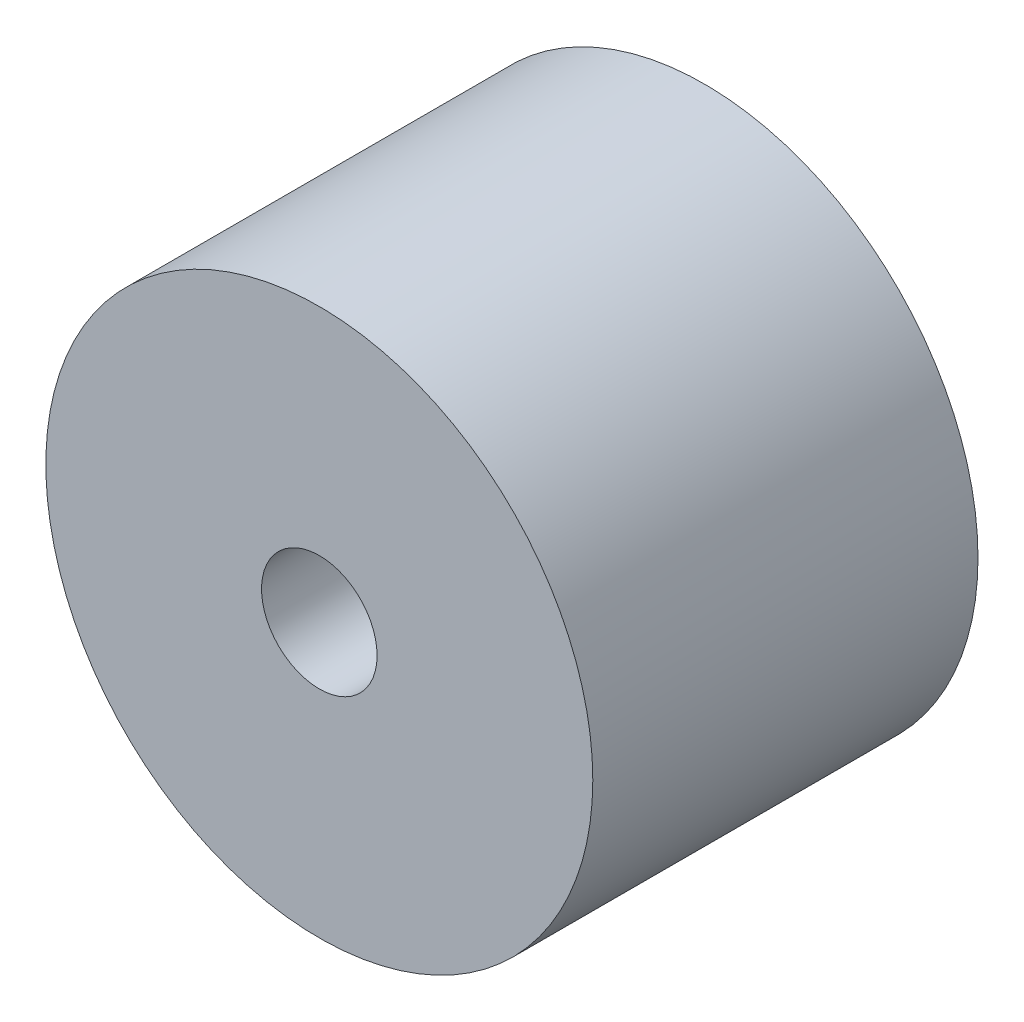
ISO-10303-21;
HEADER;
FILE_DESCRIPTION(('STEP AP214'),'2;1');
FILE_NAME('part.step','',(''),(''),'','','');
FILE_SCHEMA(('AUTOMOTIVE_DESIGN { 1 0 10303 214 1 1 1 1 }'));
ENDSEC;
DATA;
#1=APPLICATION_CONTEXT('core data for automotive mechanical design processes');
#2=APPLICATION_PROTOCOL_DEFINITION('international standard','automotive_design',2000,#1);
#3=PRODUCT_CONTEXT('',#1,'mechanical');
#4=PRODUCT('Part','Part','',(#3));
#5=PRODUCT_RELATED_PRODUCT_CATEGORY('part','',(#4));
#6=PRODUCT_DEFINITION_FORMATION('','',#4);
#7=PRODUCT_DEFINITION_CONTEXT('part definition',#1,'design');
#8=PRODUCT_DEFINITION('design','',#6,#7);
#9=PRODUCT_DEFINITION_SHAPE('','',#8);
#10=(LENGTH_UNIT() NAMED_UNIT(*) SI_UNIT(.MILLI.,.METRE.));
#11=(NAMED_UNIT(*) PLANE_ANGLE_UNIT() SI_UNIT($,.RADIAN.));
#12=(NAMED_UNIT(*) SI_UNIT($,.STERADIAN.) SOLID_ANGLE_UNIT());
#13=UNCERTAINTY_MEASURE_WITH_UNIT(LENGTH_MEASURE(1.E-05),#10,'distance_accuracy_value','');
#14=(GEOMETRIC_REPRESENTATION_CONTEXT(3) GLOBAL_UNCERTAINTY_ASSIGNED_CONTEXT((#13)) GLOBAL_UNIT_ASSIGNED_CONTEXT((#10,
#11,#12)) REPRESENTATION_CONTEXT('',''));
#15=CARTESIAN_POINT('',(0.,0.,0.));
#16=DIRECTION('',(0.,0.,1.));
#17=DIRECTION('',(1.,0.,0.));
#18=AXIS2_PLACEMENT_3D('',#15,#16,#17);
#19=CARTESIAN_POINT('',(0.,0.,20.));
#20=DIRECTION('',(0.,0.,1.));
#21=DIRECTION('',(1.,0.,0.));
#22=AXIS2_PLACEMENT_3D('',#19,#20,#21);
#23=PLANE('',#22);
#24=CARTESIAN_POINT('',(0.,0.,20.));
#25=DIRECTION('',(0.,0.,1.));
#26=DIRECTION('',(1.,0.,0.));
#27=AXIS2_PLACEMENT_3D('',#24,#25,#26);
#28=CIRCLE('',#27,14.2);
#29=CARTESIAN_POINT('',(14.2,0.,20.));
#30=VERTEX_POINT('',#29);
#31=EDGE_CURVE('E10',#30,#30,#28,.T.);
#32=ORIENTED_EDGE('',*,*,#31,.T.);
#33=EDGE_LOOP('',(#32));
#34=FACE_BOUND('',#33,.T.);
#35=CARTESIAN_POINT('',(0.,0.,20.));
#36=DIRECTION('',(0.,0.,1.));
#37=DIRECTION('',(1.,0.,0.));
#38=AXIS2_PLACEMENT_3D('',#35,#36,#37);
#39=CIRCLE('',#38,3.);
#40=CARTESIAN_POINT('',(3.,0.,20.));
#41=VERTEX_POINT('',#40);
#42=EDGE_CURVE('E54',#41,#41,#39,.T.);
#43=ORIENTED_EDGE('',*,*,#42,.F.);
#44=EDGE_LOOP('',(#43));
#45=FACE_BOUND('',#44,.T.);
#46=ADVANCED_FACE('F41',(#34,#45),#23,.T.);
#47=CARTESIAN_POINT('',(0.,0.,0.));
#48=DIRECTION('',(0.,0.,1.));
#49=DIRECTION('',(1.,0.,0.));
#50=AXIS2_PLACEMENT_3D('',#47,#48,#49);
#51=PLANE('',#50);
#52=CARTESIAN_POINT('',(0.,0.,0.));
#53=DIRECTION('',(0.,0.,1.));
#54=DIRECTION('',(1.,0.,0.));
#55=AXIS2_PLACEMENT_3D('',#52,#53,#54);
#56=CIRCLE('',#55,14.2);
#57=CARTESIAN_POINT('',(14.2,0.,0.));
#58=VERTEX_POINT('',#57);
#59=EDGE_CURVE('E44',#58,#58,#56,.T.);
#60=ORIENTED_EDGE('',*,*,#59,.F.);
#61=EDGE_LOOP('',(#60));
#62=FACE_BOUND('',#61,.T.);
#63=CARTESIAN_POINT('',(0.,0.,0.));
#64=DIRECTION('',(0.,0.,1.));
#65=DIRECTION('',(1.,0.,0.));
#66=AXIS2_PLACEMENT_3D('',#63,#64,#65);
#67=CIRCLE('',#66,3.);
#68=CARTESIAN_POINT('',(3.,0.,0.));
#69=VERTEX_POINT('',#68);
#70=EDGE_CURVE('E60',#69,#69,#67,.T.);
#71=ORIENTED_EDGE('',*,*,#70,.T.);
#72=EDGE_LOOP('',(#71));
#73=FACE_BOUND('',#72,.T.);
#74=ADVANCED_FACE('F69',(#62,#73),#51,.F.);
#75=CARTESIAN_POINT('',(0.,0.,20.));
#76=DIRECTION('',(0.,0.,-1.));
#77=DIRECTION('',(-1.,0.,0.));
#78=AXIS2_PLACEMENT_3D('',#75,#76,#77);
#79=CYLINDRICAL_SURFACE('',#78,14.2);
#80=ORIENTED_EDGE('',*,*,#31,.F.);
#81=EDGE_LOOP('',(#80));
#82=FACE_BOUND('',#81,.T.);
#83=ORIENTED_EDGE('',*,*,#59,.T.);
#84=EDGE_LOOP('',(#83));
#85=FACE_BOUND('',#84,.T.);
#86=ADVANCED_FACE('F43',(#82,#85),#79,.T.);
#87=CARTESIAN_POINT('',(0.,0.,20.));
#88=DIRECTION('',(0.,0.,-1.));
#89=DIRECTION('',(-1.,0.,0.));
#90=AXIS2_PLACEMENT_3D('',#87,#88,#89);
#91=CYLINDRICAL_SURFACE('',#90,3.);
#92=ORIENTED_EDGE('',*,*,#42,.T.);
#93=EDGE_LOOP('',(#92));
#94=FACE_BOUND('',#93,.T.);
#95=ORIENTED_EDGE('',*,*,#70,.F.);
#96=EDGE_LOOP('',(#95));
#97=FACE_BOUND('',#96,.T.);
#98=ADVANCED_FACE('F63',(#94,#97),#91,.F.);
#99=CLOSED_SHELL('',(#46,#74,#86,#98));
#100=MANIFOLD_SOLID_BREP('B2',#99);
#101=ADVANCED_BREP_SHAPE_REPRESENTATION('',(#18,#100),#14);
#102=SHAPE_DEFINITION_REPRESENTATION(#9,#101);
ENDSEC;
END-ISO-10303-21;
